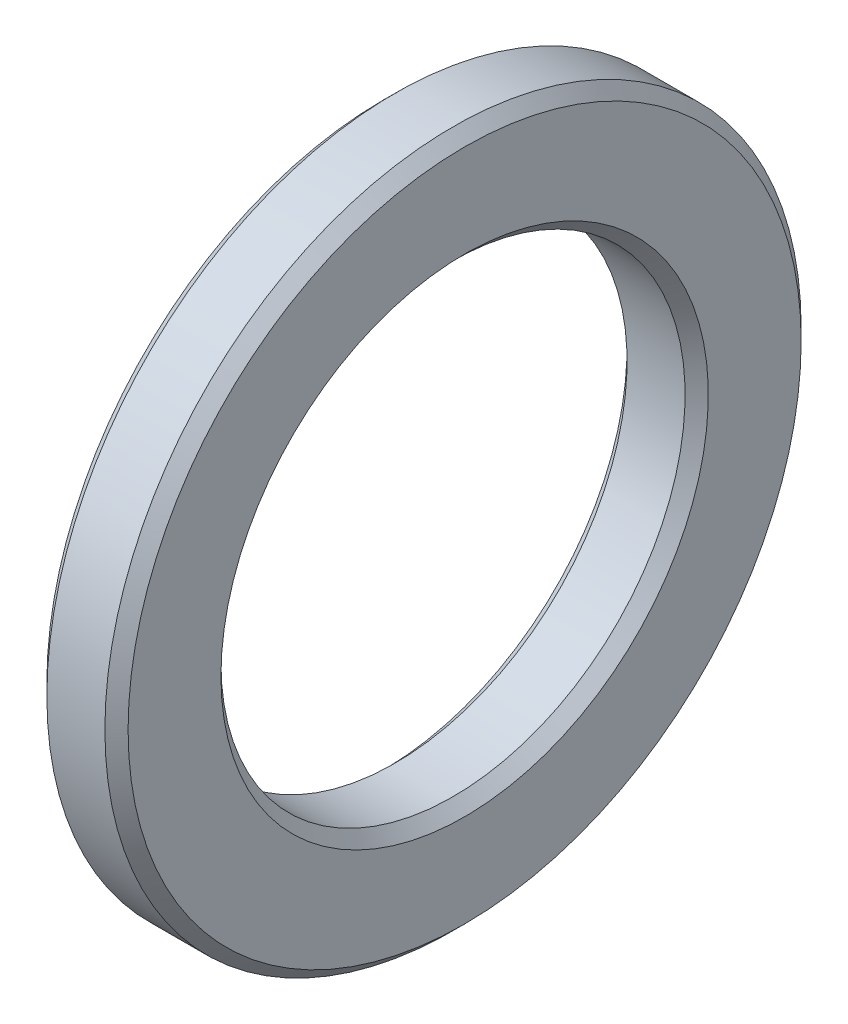
ISO-10303-21;
HEADER;
FILE_DESCRIPTION(('STEP AP214'),'2;1');
FILE_NAME('part.step','',(''),(''),'','','');
FILE_SCHEMA(('AUTOMOTIVE_DESIGN { 1 0 10303 214 1 1 1 1 }'));
ENDSEC;
DATA;
#1=APPLICATION_CONTEXT('core data for automotive mechanical design processes');
#2=APPLICATION_PROTOCOL_DEFINITION('international standard','automotive_design',2000,#1);
#3=PRODUCT_CONTEXT('',#1,'mechanical');
#4=PRODUCT('Part','Part','',(#3));
#5=PRODUCT_RELATED_PRODUCT_CATEGORY('part','',(#4));
#6=PRODUCT_DEFINITION_FORMATION('','',#4);
#7=PRODUCT_DEFINITION_CONTEXT('part definition',#1,'design');
#8=PRODUCT_DEFINITION('design','',#6,#7);
#9=PRODUCT_DEFINITION_SHAPE('','',#8);
#10=(LENGTH_UNIT() NAMED_UNIT(*) SI_UNIT(.MILLI.,.METRE.));
#11=(NAMED_UNIT(*) PLANE_ANGLE_UNIT() SI_UNIT($,.RADIAN.));
#12=(NAMED_UNIT(*) SI_UNIT($,.STERADIAN.) SOLID_ANGLE_UNIT());
#13=UNCERTAINTY_MEASURE_WITH_UNIT(LENGTH_MEASURE(1.E-05),#10,'distance_accuracy_value','');
#14=(GEOMETRIC_REPRESENTATION_CONTEXT(3) GLOBAL_UNCERTAINTY_ASSIGNED_CONTEXT((#13)) GLOBAL_UNIT_ASSIGNED_CONTEXT((#10,
#11,#12)) REPRESENTATION_CONTEXT('',''));
#15=CARTESIAN_POINT('',(0.,0.,0.));
#16=DIRECTION('',(0.,0.,1.));
#17=DIRECTION('',(1.,0.,0.));
#18=AXIS2_PLACEMENT_3D('',#15,#16,#17);
#19=CARTESIAN_POINT('',(0.,6.3,0.));
#20=DIRECTION('',(1.,0.,0.));
#21=DIRECTION('',(0.,0.,-1.));
#22=AXIS2_PLACEMENT_3D('',#19,#20,#21);
#23=PLANE('',#22);
#24=CARTESIAN_POINT('',(0.,0.,0.));
#25=DIRECTION('',(-1.,0.,0.));
#26=DIRECTION('',(0.,0.,1.));
#27=AXIS2_PLACEMENT_3D('',#24,#25,#26);
#28=CIRCLE('',#27,6.3);
#29=CARTESIAN_POINT('',(0.,0.,6.3));
#30=VERTEX_POINT('',#29);
#31=EDGE_CURVE('E58',#30,#30,#28,.T.);
#32=ORIENTED_EDGE('',*,*,#31,.F.);
#33=EDGE_LOOP('',(#32));
#34=FACE_BOUND('',#33,.T.);
#35=CARTESIAN_POINT('',(0.,0.,0.));
#36=DIRECTION('',(-1.,0.,0.));
#37=DIRECTION('',(0.,0.,1.));
#38=AXIS2_PLACEMENT_3D('',#35,#36,#37);
#39=CIRCLE('',#38,8.7);
#40=CARTESIAN_POINT('',(0.,0.,8.7));
#41=VERTEX_POINT('',#40);
#42=EDGE_CURVE('E10',#41,#41,#39,.T.);
#43=ORIENTED_EDGE('',*,*,#42,.T.);
#44=EDGE_LOOP('',(#43));
#45=FACE_BOUND('',#44,.T.);
#46=ADVANCED_FACE('F30',(#34,#45),#23,.F.);
#47=CARTESIAN_POINT('',(0.3,0.,0.));
#48=DIRECTION('',(1.,0.,0.));
#49=DIRECTION('',(0.,0.,-1.));
#50=AXIS2_PLACEMENT_3D('',#47,#48,#49);
#51=CONICAL_SURFACE('',#50,9.,0.785398163397448);
#52=ORIENTED_EDGE('',*,*,#42,.F.);
#53=EDGE_LOOP('',(#52));
#54=FACE_BOUND('',#53,.T.);
#55=CARTESIAN_POINT('',(0.3,0.,0.));
#56=DIRECTION('',(-1.,0.,0.));
#57=DIRECTION('',(0.,0.,1.));
#58=AXIS2_PLACEMENT_3D('',#55,#56,#57);
#59=CIRCLE('',#58,9.);
#60=CARTESIAN_POINT('',(0.3,0.,9.));
#61=VERTEX_POINT('',#60);
#62=EDGE_CURVE('E36',#61,#61,#59,.T.);
#63=ORIENTED_EDGE('',*,*,#62,.T.);
#64=EDGE_LOOP('',(#63));
#65=FACE_BOUND('',#64,.T.);
#66=ADVANCED_FACE('F65',(#54,#65),#51,.T.);
#67=CARTESIAN_POINT('',(-15.0830508474576,0.,0.));
#68=DIRECTION('',(-1.,0.,0.));
#69=DIRECTION('',(0.,0.,1.));
#70=AXIS2_PLACEMENT_3D('',#67,#68,#69);
#71=CYLINDRICAL_SURFACE('',#70,9.);
#72=ORIENTED_EDGE('',*,*,#62,.F.);
#73=EDGE_LOOP('',(#72));
#74=FACE_BOUND('',#73,.T.);
#75=CARTESIAN_POINT('',(1.8,0.,0.));
#76=DIRECTION('',(-1.,0.,0.));
#77=DIRECTION('',(0.,0.,1.));
#78=AXIS2_PLACEMENT_3D('',#75,#76,#77);
#79=CIRCLE('',#78,9.);
#80=CARTESIAN_POINT('',(1.8,0.,9.));
#81=VERTEX_POINT('',#80);
#82=EDGE_CURVE('E40',#81,#81,#79,.T.);
#83=ORIENTED_EDGE('',*,*,#82,.T.);
#84=EDGE_LOOP('',(#83));
#85=FACE_BOUND('',#84,.T.);
#86=ADVANCED_FACE('F69',(#74,#85),#71,.T.);
#87=CARTESIAN_POINT('',(2.1,0.,0.));
#88=DIRECTION('',(-1.,0.,0.));
#89=DIRECTION('',(0.,0.,1.));
#90=AXIS2_PLACEMENT_3D('',#87,#88,#89);
#91=CONICAL_SURFACE('',#90,8.7,0.785398163397445);
#92=ORIENTED_EDGE('',*,*,#82,.F.);
#93=EDGE_LOOP('',(#92));
#94=FACE_BOUND('',#93,.T.);
#95=CARTESIAN_POINT('',(2.1,0.,0.));
#96=DIRECTION('',(-1.,0.,0.));
#97=DIRECTION('',(0.,0.,1.));
#98=AXIS2_PLACEMENT_3D('',#95,#96,#97);
#99=CIRCLE('',#98,8.7);
#100=CARTESIAN_POINT('',(2.1,0.,8.7));
#101=VERTEX_POINT('',#100);
#102=EDGE_CURVE('E44',#101,#101,#99,.T.);
#103=ORIENTED_EDGE('',*,*,#102,.T.);
#104=EDGE_LOOP('',(#103));
#105=FACE_BOUND('',#104,.T.);
#106=ADVANCED_FACE('F74',(#94,#105),#91,.T.);
#107=CARTESIAN_POINT('',(2.1,6.3,0.));
#108=DIRECTION('',(-1.,0.,0.));
#109=DIRECTION('',(0.,0.,1.));
#110=AXIS2_PLACEMENT_3D('',#107,#108,#109);
#111=PLANE('',#110);
#112=ORIENTED_EDGE('',*,*,#102,.F.);
#113=EDGE_LOOP('',(#112));
#114=FACE_BOUND('',#113,.T.);
#115=CARTESIAN_POINT('',(2.1,0.,0.));
#116=DIRECTION('',(-1.,0.,0.));
#117=DIRECTION('',(0.,0.,1.));
#118=AXIS2_PLACEMENT_3D('',#115,#116,#117);
#119=CIRCLE('',#118,6.3);
#120=CARTESIAN_POINT('',(2.1,0.,6.3));
#121=VERTEX_POINT('',#120);
#122=EDGE_CURVE('E49',#121,#121,#119,.T.);
#123=ORIENTED_EDGE('',*,*,#122,.T.);
#124=EDGE_LOOP('',(#123));
#125=FACE_BOUND('',#124,.T.);
#126=ADVANCED_FACE('F80',(#114,#125),#111,.F.);
#127=CARTESIAN_POINT('',(1.8,0.,0.));
#128=DIRECTION('',(1.,0.,0.));
#129=DIRECTION('',(0.,0.,-1.));
#130=AXIS2_PLACEMENT_3D('',#127,#128,#129);
#131=CONICAL_SURFACE('',#130,6.,0.785398163397445);
#132=ORIENTED_EDGE('',*,*,#122,.F.);
#133=EDGE_LOOP('',(#132));
#134=FACE_BOUND('',#133,.T.);
#135=CARTESIAN_POINT('',(1.8,0.,0.));
#136=DIRECTION('',(-1.,0.,0.));
#137=DIRECTION('',(0.,0.,1.));
#138=AXIS2_PLACEMENT_3D('',#135,#136,#137);
#139=CIRCLE('',#138,6.);
#140=CARTESIAN_POINT('',(1.8,0.,6.));
#141=VERTEX_POINT('',#140);
#142=EDGE_CURVE('E52',#141,#141,#139,.T.);
#143=ORIENTED_EDGE('',*,*,#142,.T.);
#144=EDGE_LOOP('',(#143));
#145=FACE_BOUND('',#144,.T.);
#146=ADVANCED_FACE('F84',(#134,#145),#131,.F.);
#147=CARTESIAN_POINT('',(-15.0830508474576,0.,0.));
#148=DIRECTION('',(-1.,0.,0.));
#149=DIRECTION('',(0.,0.,1.));
#150=AXIS2_PLACEMENT_3D('',#147,#148,#149);
#151=CYLINDRICAL_SURFACE('',#150,6.);
#152=ORIENTED_EDGE('',*,*,#142,.F.);
#153=EDGE_LOOP('',(#152));
#154=FACE_BOUND('',#153,.T.);
#155=CARTESIAN_POINT('',(0.3,0.,0.));
#156=DIRECTION('',(-1.,0.,0.));
#157=DIRECTION('',(0.,0.,1.));
#158=AXIS2_PLACEMENT_3D('',#155,#156,#157);
#159=CIRCLE('',#158,6.);
#160=CARTESIAN_POINT('',(0.3,0.,6.));
#161=VERTEX_POINT('',#160);
#162=EDGE_CURVE('E55',#161,#161,#159,.T.);
#163=ORIENTED_EDGE('',*,*,#162,.T.);
#164=EDGE_LOOP('',(#163));
#165=FACE_BOUND('',#164,.T.);
#166=ADVANCED_FACE('F88',(#154,#165),#151,.F.);
#167=CARTESIAN_POINT('',(0.,0.,0.));
#168=DIRECTION('',(-1.,0.,0.));
#169=DIRECTION('',(0.,0.,1.));
#170=AXIS2_PLACEMENT_3D('',#167,#168,#169);
#171=CONICAL_SURFACE('',#170,6.3,0.785398163397448);
#172=ORIENTED_EDGE('',*,*,#162,.F.);
#173=EDGE_LOOP('',(#172));
#174=FACE_BOUND('',#173,.T.);
#175=ORIENTED_EDGE('',*,*,#31,.T.);
#176=EDGE_LOOP('',(#175));
#177=FACE_BOUND('',#176,.T.);
#178=ADVANCED_FACE('F62',(#174,#177),#171,.F.);
#179=CLOSED_SHELL('',(#46,#66,#86,#106,#126,#146,#166,#178));
#180=MANIFOLD_SOLID_BREP('B2',#179);
#181=ADVANCED_BREP_SHAPE_REPRESENTATION('',(#18,#180),#14);
#182=SHAPE_DEFINITION_REPRESENTATION(#9,#181);
ENDSEC;
END-ISO-10303-21;
